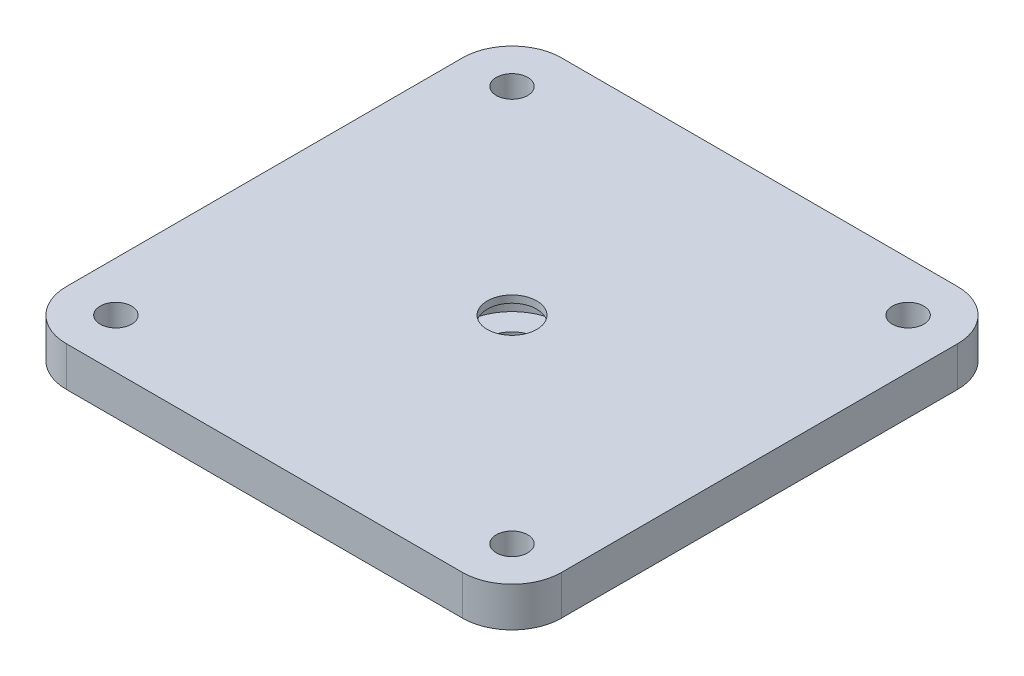
ISO-10303-21;
HEADER;
FILE_DESCRIPTION(('STEP AP214'),'2;1');
FILE_NAME('part.step','',(''),(''),'','','');
FILE_SCHEMA(('AUTOMOTIVE_DESIGN { 1 0 10303 214 1 1 1 1 }'));
ENDSEC;
DATA;
#1=APPLICATION_CONTEXT('core data for automotive mechanical design processes');
#2=APPLICATION_PROTOCOL_DEFINITION('international standard','automotive_design',2000,#1);
#3=PRODUCT_CONTEXT('',#1,'mechanical');
#4=PRODUCT('Part','Part','',(#3));
#5=PRODUCT_RELATED_PRODUCT_CATEGORY('part','',(#4));
#6=PRODUCT_DEFINITION_FORMATION('','',#4);
#7=PRODUCT_DEFINITION_CONTEXT('part definition',#1,'design');
#8=PRODUCT_DEFINITION('design','',#6,#7);
#9=PRODUCT_DEFINITION_SHAPE('','',#8);
#10=(LENGTH_UNIT() NAMED_UNIT(*) SI_UNIT(.MILLI.,.METRE.));
#11=(NAMED_UNIT(*) PLANE_ANGLE_UNIT() SI_UNIT($,.RADIAN.));
#12=(NAMED_UNIT(*) SI_UNIT($,.STERADIAN.) SOLID_ANGLE_UNIT());
#13=UNCERTAINTY_MEASURE_WITH_UNIT(LENGTH_MEASURE(1.E-05),#10,'distance_accuracy_value','');
#14=(GEOMETRIC_REPRESENTATION_CONTEXT(3) GLOBAL_UNCERTAINTY_ASSIGNED_CONTEXT((#13)) GLOBAL_UNIT_ASSIGNED_CONTEXT((#10,
#11,#12)) REPRESENTATION_CONTEXT('',''));
#15=CARTESIAN_POINT('',(0.,0.,0.));
#16=DIRECTION('',(0.,0.,1.));
#17=DIRECTION('',(1.,0.,0.));
#18=AXIS2_PLACEMENT_3D('',#15,#16,#17);
#19=CARTESIAN_POINT('',(-1.19904076738608,0.,-2.75779376498803));
#20=DIRECTION('',(0.,1.,0.));
#21=DIRECTION('',(0.,0.,1.));
#22=AXIS2_PLACEMENT_3D('',#19,#20,#21);
#23=CYLINDRICAL_SURFACE('',#22,5.);
#24=CARTESIAN_POINT('',(-1.19904076738608,3.55,-2.75779376498803));
#25=DIRECTION('',(0.,1.,0.));
#26=DIRECTION('',(0.,0.,1.));
#27=AXIS2_PLACEMENT_3D('',#24,#25,#26);
#28=CIRCLE('',#27,5.);
#29=CARTESIAN_POINT('',(-1.19904076738608,3.55,2.24220623501198));
#30=VERTEX_POINT('',#29);
#31=EDGE_CURVE('E62',#30,#30,#28,.F.);
#32=ORIENTED_EDGE('',*,*,#31,.F.);
#33=EDGE_LOOP('',(#32));
#34=FACE_BOUND('',#33,.T.);
#35=CARTESIAN_POINT('',(-1.19904076738608,2.,-2.75779376498803));
#36=DIRECTION('',(0.,-1.,0.));
#37=DIRECTION('',(0.,0.,-1.));
#38=AXIS2_PLACEMENT_3D('',#35,#36,#37);
#39=CIRCLE('',#38,5.);
#40=CARTESIAN_POINT('',(-1.19904076738608,2.,-7.75779376498803));
#41=VERTEX_POINT('',#40);
#42=EDGE_CURVE('E223',#41,#41,#39,.F.);
#43=ORIENTED_EDGE('',*,*,#42,.F.);
#44=EDGE_LOOP('',(#43));
#45=FACE_BOUND('',#44,.T.);
#46=ADVANCED_FACE('F58',(#34,#45),#23,.F.);
#47=CARTESIAN_POINT('',(48.8009592326139,10.,0.));
#48=DIRECTION('',(1.,0.,0.));
#49=DIRECTION('',(0.,0.,-1.));
#50=AXIS2_PLACEMENT_3D('',#47,#48,#49);
#51=PLANE('',#50);
#52=DIRECTION('',(0.,-1.,0.));
#53=VECTOR('',#52,1.);
#54=CARTESIAN_POINT('',(48.8009592326139,10.,37.2422062350119));
#55=LINE('',#54,#53);
#56=CARTESIAN_POINT('',(48.8009592326139,10.,37.2422062350119));
#57=VERTEX_POINT('',#56);
#58=CARTESIAN_POINT('',(48.8009592326139,2.,37.2422062350119));
#59=VERTEX_POINT('',#58);
#60=EDGE_CURVE('E142',#57,#59,#55,.T.);
#61=ORIENTED_EDGE('',*,*,#60,.T.);
#62=DIRECTION('',(0.,0.,1.));
#63=VECTOR('',#62,1.);
#64=CARTESIAN_POINT('',(48.8009592326139,2.,-42.757793764988));
#65=LINE('',#64,#63);
#66=CARTESIAN_POINT('',(48.8009592326139,2.,-42.757793764988));
#67=VERTEX_POINT('',#66);
#68=EDGE_CURVE('E76',#67,#59,#65,.T.);
#69=ORIENTED_EDGE('',*,*,#68,.F.);
#70=DIRECTION('',(0.,-1.,0.));
#71=VECTOR('',#70,1.);
#72=CARTESIAN_POINT('',(48.8009592326139,10.,-42.757793764988));
#73=LINE('',#72,#71);
#74=CARTESIAN_POINT('',(48.8009592326139,10.,-42.757793764988));
#75=VERTEX_POINT('',#74);
#76=EDGE_CURVE('E11',#75,#67,#73,.T.);
#77=ORIENTED_EDGE('',*,*,#76,.F.);
#78=DIRECTION('',(0.,0.,1.));
#79=VECTOR('',#78,1.);
#80=CARTESIAN_POINT('',(48.8009592326139,10.,0.));
#81=LINE('',#80,#79);
#82=EDGE_CURVE('E152',#75,#57,#81,.T.);
#83=ORIENTED_EDGE('',*,*,#82,.T.);
#84=EDGE_LOOP('',(#61,#69,#77,#83));
#85=FACE_BOUND('',#84,.T.);
#86=ADVANCED_FACE('F139',(#85),#51,.T.);
#87=CARTESIAN_POINT('',(38.8009592326139,10.,-42.757793764988));
#88=DIRECTION('',(0.,-1.,0.));
#89=DIRECTION('',(0.,0.,-1.));
#90=AXIS2_PLACEMENT_3D('',#87,#88,#89);
#91=CYLINDRICAL_SURFACE('',#90,10.);
#92=CARTESIAN_POINT('',(38.8009592326139,2.,-42.757793764988));
#93=DIRECTION('',(0.,-1.,0.));
#94=DIRECTION('',(0.,0.,-1.));
#95=AXIS2_PLACEMENT_3D('',#92,#93,#94);
#96=CIRCLE('',#95,10.);
#97=CARTESIAN_POINT('',(38.8009592326139,2.,-52.757793764988));
#98=VERTEX_POINT('',#97);
#99=EDGE_CURVE('E127',#98,#67,#96,.T.);
#100=ORIENTED_EDGE('',*,*,#99,.F.);
#101=DIRECTION('',(0.,-1.,0.));
#102=VECTOR('',#101,1.);
#103=CARTESIAN_POINT('',(38.8009592326139,10.,-52.757793764988));
#104=LINE('',#103,#102);
#105=CARTESIAN_POINT('',(38.8009592326139,10.,-52.757793764988));
#106=VERTEX_POINT('',#105);
#107=EDGE_CURVE('E68',#106,#98,#104,.T.);
#108=ORIENTED_EDGE('',*,*,#107,.F.);
#109=CARTESIAN_POINT('',(38.8009592326139,10.,-42.757793764988));
#110=DIRECTION('',(0.,1.,0.));
#111=DIRECTION('',(0.,0.,1.));
#112=AXIS2_PLACEMENT_3D('',#109,#110,#111);
#113=CIRCLE('',#112,10.);
#114=EDGE_CURVE('E147',#75,#106,#113,.T.);
#115=ORIENTED_EDGE('',*,*,#114,.F.);
#116=ORIENTED_EDGE('',*,*,#76,.T.);
#117=EDGE_LOOP('',(#100,#108,#115,#116));
#118=FACE_BOUND('',#117,.T.);
#119=ADVANCED_FACE('F146',(#118),#91,.T.);
#120=CARTESIAN_POINT('',(0.,10.,-52.757793764988));
#121=DIRECTION('',(0.,0.,-1.));
#122=DIRECTION('',(-1.,0.,0.));
#123=AXIS2_PLACEMENT_3D('',#120,#121,#122);
#124=PLANE('',#123);
#125=ORIENTED_EDGE('',*,*,#107,.T.);
#126=DIRECTION('',(1.,0.,0.));
#127=VECTOR('',#126,1.);
#128=CARTESIAN_POINT('',(-41.199040767386,2.,-52.757793764988));
#129=LINE('',#128,#127);
#130=CARTESIAN_POINT('',(-41.1990407673861,2.,-52.757793764988));
#131=VERTEX_POINT('',#130);
#132=EDGE_CURVE('E131',#131,#98,#129,.T.);
#133=ORIENTED_EDGE('',*,*,#132,.F.);
#134=DIRECTION('',(0.,-1.,0.));
#135=VECTOR('',#134,1.);
#136=CARTESIAN_POINT('',(-41.199040767386,10.,-52.757793764988));
#137=LINE('',#136,#135);
#138=CARTESIAN_POINT('',(-41.199040767386,10.,-52.757793764988));
#139=VERTEX_POINT('',#138);
#140=EDGE_CURVE('E201',#139,#131,#137,.T.);
#141=ORIENTED_EDGE('',*,*,#140,.F.);
#142=DIRECTION('',(1.,0.,0.));
#143=VECTOR('',#142,1.);
#144=CARTESIAN_POINT('',(0.,10.,-52.757793764988));
#145=LINE('',#144,#143);
#146=EDGE_CURVE('E151',#139,#106,#145,.T.);
#147=ORIENTED_EDGE('',*,*,#146,.T.);
#148=EDGE_LOOP('',(#125,#133,#141,#147));
#149=FACE_BOUND('',#148,.T.);
#150=ADVANCED_FACE('F311',(#149),#124,.T.);
#151=CARTESIAN_POINT('',(-41.1990407673861,10.,-42.757793764988));
#152=DIRECTION('',(0.,-1.,0.));
#153=DIRECTION('',(0.,0.,-1.));
#154=AXIS2_PLACEMENT_3D('',#151,#152,#153);
#155=CYLINDRICAL_SURFACE('',#154,10.);
#156=CARTESIAN_POINT('',(-41.1990407673861,2.,-42.757793764988));
#157=DIRECTION('',(0.,-1.,0.));
#158=DIRECTION('',(0.,0.,-1.));
#159=AXIS2_PLACEMENT_3D('',#156,#157,#158);
#160=CIRCLE('',#159,10.);
#161=CARTESIAN_POINT('',(-51.1990407673861,2.,-42.757793764988));
#162=VERTEX_POINT('',#161);
#163=EDGE_CURVE('E280',#162,#131,#160,.T.);
#164=ORIENTED_EDGE('',*,*,#163,.F.);
#165=DIRECTION('',(0.,-1.,0.));
#166=VECTOR('',#165,1.);
#167=CARTESIAN_POINT('',(-51.1990407673861,10.,-42.757793764988));
#168=LINE('',#167,#166);
#169=CARTESIAN_POINT('',(-51.1990407673861,10.,-42.757793764988));
#170=VERTEX_POINT('',#169);
#171=EDGE_CURVE('E197',#170,#162,#168,.T.);
#172=ORIENTED_EDGE('',*,*,#171,.F.);
#173=CARTESIAN_POINT('',(-41.1990407673861,10.,-42.757793764988));
#174=DIRECTION('',(0.,1.,0.));
#175=DIRECTION('',(0.,0.,1.));
#176=AXIS2_PLACEMENT_3D('',#173,#174,#175);
#177=CIRCLE('',#176,10.);
#178=EDGE_CURVE('E166',#139,#170,#177,.T.);
#179=ORIENTED_EDGE('',*,*,#178,.F.);
#180=ORIENTED_EDGE('',*,*,#140,.T.);
#181=EDGE_LOOP('',(#164,#172,#179,#180));
#182=FACE_BOUND('',#181,.T.);
#183=ADVANCED_FACE('F309',(#182),#155,.T.);
#184=CARTESIAN_POINT('',(-51.1990407673861,10.,0.));
#185=DIRECTION('',(1.,0.,0.));
#186=DIRECTION('',(0.,0.,-1.));
#187=AXIS2_PLACEMENT_3D('',#184,#185,#186);
#188=PLANE('',#187);
#189=DIRECTION('',(0.,0.,-1.));
#190=VECTOR('',#189,1.);
#191=CARTESIAN_POINT('',(-51.1990407673861,2.,37.2422062350119));
#192=LINE('',#191,#190);
#193=CARTESIAN_POINT('',(-51.1990407673861,2.,37.2422062350119));
#194=VERTEX_POINT('',#193);
#195=EDGE_CURVE('E283',#194,#162,#192,.T.);
#196=ORIENTED_EDGE('',*,*,#195,.F.);
#197=DIRECTION('',(0.,-1.,0.));
#198=VECTOR('',#197,1.);
#199=CARTESIAN_POINT('',(-51.1990407673861,10.,37.2422062350119));
#200=LINE('',#199,#198);
#201=CARTESIAN_POINT('',(-51.1990407673861,10.,37.2422062350119));
#202=VERTEX_POINT('',#201);
#203=EDGE_CURVE('E193',#202,#194,#200,.T.);
#204=ORIENTED_EDGE('',*,*,#203,.F.);
#205=DIRECTION('',(0.,0.,1.));
#206=VECTOR('',#205,1.);
#207=CARTESIAN_POINT('',(-51.1990407673861,10.,0.));
#208=LINE('',#207,#206);
#209=EDGE_CURVE('E170',#170,#202,#208,.T.);
#210=ORIENTED_EDGE('',*,*,#209,.F.);
#211=ORIENTED_EDGE('',*,*,#171,.T.);
#212=EDGE_LOOP('',(#196,#204,#210,#211));
#213=FACE_BOUND('',#212,.T.);
#214=ADVANCED_FACE('F305',(#213),#188,.F.);
#215=CARTESIAN_POINT('',(-41.1990407673861,10.,37.242206235012));
#216=DIRECTION('',(0.,-1.,0.));
#217=DIRECTION('',(0.,0.,-1.));
#218=AXIS2_PLACEMENT_3D('',#215,#216,#217);
#219=CYLINDRICAL_SURFACE('',#218,10.);
#220=CARTESIAN_POINT('',(-41.1990407673861,2.,37.242206235012));
#221=DIRECTION('',(0.,-1.,0.));
#222=DIRECTION('',(0.,0.,-1.));
#223=AXIS2_PLACEMENT_3D('',#220,#221,#222);
#224=CIRCLE('',#223,10.);
#225=CARTESIAN_POINT('',(-41.199040767386,2.,47.242206235012));
#226=VERTEX_POINT('',#225);
#227=EDGE_CURVE('E286',#226,#194,#224,.T.);
#228=ORIENTED_EDGE('',*,*,#227,.F.);
#229=DIRECTION('',(0.,-1.,0.));
#230=VECTOR('',#229,1.);
#231=CARTESIAN_POINT('',(-41.199040767386,10.,47.242206235012));
#232=LINE('',#231,#230);
#233=CARTESIAN_POINT('',(-41.199040767386,10.,47.242206235012));
#234=VERTEX_POINT('',#233);
#235=EDGE_CURVE('E189',#234,#226,#232,.T.);
#236=ORIENTED_EDGE('',*,*,#235,.F.);
#237=CARTESIAN_POINT('',(-41.1990407673861,10.,37.242206235012));
#238=DIRECTION('',(0.,1.,0.));
#239=DIRECTION('',(0.,0.,1.));
#240=AXIS2_PLACEMENT_3D('',#237,#238,#239);
#241=CIRCLE('',#240,10.);
#242=EDGE_CURVE('E174',#202,#234,#241,.T.);
#243=ORIENTED_EDGE('',*,*,#242,.F.);
#244=ORIENTED_EDGE('',*,*,#203,.T.);
#245=EDGE_LOOP('',(#228,#236,#243,#244));
#246=FACE_BOUND('',#245,.T.);
#247=ADVANCED_FACE('F301',(#246),#219,.T.);
#248=CARTESIAN_POINT('',(0.,10.,47.242206235012));
#249=DIRECTION('',(0.,0.,-1.));
#250=DIRECTION('',(-1.,0.,0.));
#251=AXIS2_PLACEMENT_3D('',#248,#249,#250);
#252=PLANE('',#251);
#253=DIRECTION('',(-1.,0.,0.));
#254=VECTOR('',#253,1.);
#255=CARTESIAN_POINT('',(38.8009592326139,2.,47.242206235012));
#256=LINE('',#255,#254);
#257=CARTESIAN_POINT('',(38.8009592326139,2.,47.242206235012));
#258=VERTEX_POINT('',#257);
#259=EDGE_CURVE('E289',#258,#226,#256,.T.);
#260=ORIENTED_EDGE('',*,*,#259,.F.);
#261=DIRECTION('',(0.,-1.,0.));
#262=VECTOR('',#261,1.);
#263=CARTESIAN_POINT('',(38.8009592326139,10.,47.242206235012));
#264=LINE('',#263,#262);
#265=CARTESIAN_POINT('',(38.8009592326139,10.,47.242206235012));
#266=VERTEX_POINT('',#265);
#267=EDGE_CURVE('E185',#266,#258,#264,.T.);
#268=ORIENTED_EDGE('',*,*,#267,.F.);
#269=DIRECTION('',(1.,0.,0.));
#270=VECTOR('',#269,1.);
#271=CARTESIAN_POINT('',(0.,10.,47.242206235012));
#272=LINE('',#271,#270);
#273=EDGE_CURVE('E178',#234,#266,#272,.T.);
#274=ORIENTED_EDGE('',*,*,#273,.F.);
#275=ORIENTED_EDGE('',*,*,#235,.T.);
#276=EDGE_LOOP('',(#260,#268,#274,#275));
#277=FACE_BOUND('',#276,.T.);
#278=ADVANCED_FACE('F256',(#277),#252,.F.);
#279=CARTESIAN_POINT('',(-41.1990407673861,10.,-42.757793764988));
#280=DIRECTION('',(0.,-1.,0.));
#281=DIRECTION('',(0.,0.,-1.));
#282=AXIS2_PLACEMENT_3D('',#279,#280,#281);
#283=CYLINDRICAL_SURFACE('',#282,3.175);
#284=CARTESIAN_POINT('',(-41.1990407673861,10.,-42.757793764988));
#285=DIRECTION('',(0.,1.,0.));
#286=DIRECTION('',(0.,0.,1.));
#287=AXIS2_PLACEMENT_3D('',#284,#285,#286);
#288=CIRCLE('',#287,3.175);
#289=CARTESIAN_POINT('',(-41.1990407673861,10.,-39.582793764988));
#290=VERTEX_POINT('',#289);
#291=EDGE_CURVE('E156',#290,#290,#288,.T.);
#292=ORIENTED_EDGE('',*,*,#291,.T.);
#293=EDGE_LOOP('',(#292));
#294=FACE_BOUND('',#293,.T.);
#295=CARTESIAN_POINT('',(-41.1990407673861,2.,-42.757793764988));
#296=DIRECTION('',(0.,-1.,0.));
#297=DIRECTION('',(0.,0.,-1.));
#298=AXIS2_PLACEMENT_3D('',#295,#296,#297);
#299=CIRCLE('',#298,3.175);
#300=CARTESIAN_POINT('',(-41.1990407673861,2.,-45.932793764988));
#301=VERTEX_POINT('',#300);
#302=EDGE_CURVE('E260',#301,#301,#299,.T.);
#303=ORIENTED_EDGE('',*,*,#302,.T.);
#304=EDGE_LOOP('',(#303));
#305=FACE_BOUND('',#304,.T.);
#306=ADVANCED_FACE('F253',(#294,#305),#283,.F.);
#307=CARTESIAN_POINT('',(38.8009592326139,10.,-42.757793764988));
#308=DIRECTION('',(0.,-1.,0.));
#309=DIRECTION('',(0.,0.,-1.));
#310=AXIS2_PLACEMENT_3D('',#307,#308,#309);
#311=CYLINDRICAL_SURFACE('',#310,3.175);
#312=CARTESIAN_POINT('',(38.8009592326139,10.,-42.757793764988));
#313=DIRECTION('',(0.,1.,0.));
#314=DIRECTION('',(0.,0.,1.));
#315=AXIS2_PLACEMENT_3D('',#312,#313,#314);
#316=CIRCLE('',#315,3.175);
#317=CARTESIAN_POINT('',(38.8009592326139,10.,-39.582793764988));
#318=VERTEX_POINT('',#317);
#319=EDGE_CURVE('E160',#318,#318,#316,.T.);
#320=ORIENTED_EDGE('',*,*,#319,.T.);
#321=EDGE_LOOP('',(#320));
#322=FACE_BOUND('',#321,.T.);
#323=CARTESIAN_POINT('',(38.8009592326139,2.,-42.757793764988));
#324=DIRECTION('',(0.,-1.,0.));
#325=DIRECTION('',(0.,0.,-1.));
#326=AXIS2_PLACEMENT_3D('',#323,#324,#325);
#327=CIRCLE('',#326,3.175);
#328=CARTESIAN_POINT('',(38.8009592326139,2.,-45.932793764988));
#329=VERTEX_POINT('',#328);
#330=EDGE_CURVE('E263',#329,#329,#327,.T.);
#331=ORIENTED_EDGE('',*,*,#330,.T.);
#332=EDGE_LOOP('',(#331));
#333=FACE_BOUND('',#332,.T.);
#334=ADVANCED_FACE('F242',(#322,#333),#311,.F.);
#335=CARTESIAN_POINT('',(38.8009592326139,10.,37.242206235012));
#336=DIRECTION('',(0.,-1.,0.));
#337=DIRECTION('',(0.,0.,-1.));
#338=AXIS2_PLACEMENT_3D('',#335,#336,#337);
#339=CYLINDRICAL_SURFACE('',#338,3.175);
#340=CARTESIAN_POINT('',(38.8009592326139,10.,37.242206235012));
#341=DIRECTION('',(0.,1.,0.));
#342=DIRECTION('',(0.,0.,1.));
#343=AXIS2_PLACEMENT_3D('',#340,#341,#342);
#344=CIRCLE('',#343,3.175);
#345=CARTESIAN_POINT('',(38.8009592326139,10.,40.417206235012));
#346=VERTEX_POINT('',#345);
#347=EDGE_CURVE('E235',#346,#346,#344,.T.);
#348=ORIENTED_EDGE('',*,*,#347,.T.);
#349=EDGE_LOOP('',(#348));
#350=FACE_BOUND('',#349,.T.);
#351=CARTESIAN_POINT('',(38.8009592326139,2.,37.242206235012));
#352=DIRECTION('',(0.,-1.,0.));
#353=DIRECTION('',(0.,0.,-1.));
#354=AXIS2_PLACEMENT_3D('',#351,#352,#353);
#355=CIRCLE('',#354,3.175);
#356=CARTESIAN_POINT('',(38.8009592326139,2.,34.067206235012));
#357=VERTEX_POINT('',#356);
#358=EDGE_CURVE('E268',#357,#357,#355,.T.);
#359=ORIENTED_EDGE('',*,*,#358,.T.);
#360=EDGE_LOOP('',(#359));
#361=FACE_BOUND('',#360,.T.);
#362=ADVANCED_FACE('F345',(#350,#361),#339,.F.);
#363=CARTESIAN_POINT('',(-41.1990407673861,10.,37.242206235012));
#364=DIRECTION('',(0.,-1.,0.));
#365=DIRECTION('',(0.,0.,-1.));
#366=AXIS2_PLACEMENT_3D('',#363,#364,#365);
#367=CYLINDRICAL_SURFACE('',#366,3.175);
#368=CARTESIAN_POINT('',(-41.1990407673861,10.,37.242206235012));
#369=DIRECTION('',(0.,1.,0.));
#370=DIRECTION('',(0.,0.,1.));
#371=AXIS2_PLACEMENT_3D('',#368,#369,#370);
#372=CIRCLE('',#371,3.175);
#373=CARTESIAN_POINT('',(-41.1990407673861,10.,40.417206235012));
#374=VERTEX_POINT('',#373);
#375=EDGE_CURVE('E231',#374,#374,#372,.T.);
#376=ORIENTED_EDGE('',*,*,#375,.T.);
#377=EDGE_LOOP('',(#376));
#378=FACE_BOUND('',#377,.T.);
#379=CARTESIAN_POINT('',(-41.1990407673861,2.,37.242206235012));
#380=DIRECTION('',(0.,-1.,0.));
#381=DIRECTION('',(0.,0.,-1.));
#382=AXIS2_PLACEMENT_3D('',#379,#380,#381);
#383=CIRCLE('',#382,3.175);
#384=CARTESIAN_POINT('',(-41.1990407673861,2.,34.067206235012));
#385=VERTEX_POINT('',#384);
#386=EDGE_CURVE('E274',#385,#385,#383,.T.);
#387=ORIENTED_EDGE('',*,*,#386,.T.);
#388=EDGE_LOOP('',(#387));
#389=FACE_BOUND('',#388,.T.);
#390=ADVANCED_FACE('F60',(#378,#389),#367,.F.);
#391=CARTESIAN_POINT('',(38.8009592326139,10.,37.242206235012));
#392=DIRECTION('',(0.,-1.,0.));
#393=DIRECTION('',(0.,0.,-1.));
#394=AXIS2_PLACEMENT_3D('',#391,#392,#393);
#395=CYLINDRICAL_SURFACE('',#394,9.99999999999999);
#396=CARTESIAN_POINT('',(38.8009592326139,2.,37.242206235012));
#397=DIRECTION('',(0.,-1.,0.));
#398=DIRECTION('',(0.,0.,-1.));
#399=AXIS2_PLACEMENT_3D('',#396,#397,#398);
#400=CIRCLE('',#399,9.99999999999999);
#401=EDGE_CURVE('E144',#59,#258,#400,.T.);
#402=ORIENTED_EDGE('',*,*,#401,.F.);
#403=ORIENTED_EDGE('',*,*,#60,.F.);
#404=CARTESIAN_POINT('',(38.8009592326139,10.,37.242206235012));
#405=DIRECTION('',(0.,1.,0.));
#406=DIRECTION('',(0.,0.,1.));
#407=AXIS2_PLACEMENT_3D('',#404,#405,#406);
#408=CIRCLE('',#407,9.99999999999999);
#409=EDGE_CURVE('E86',#266,#57,#408,.T.);
#410=ORIENTED_EDGE('',*,*,#409,.F.);
#411=ORIENTED_EDGE('',*,*,#267,.T.);
#412=EDGE_LOOP('',(#402,#403,#410,#411));
#413=FACE_BOUND('',#412,.T.);
#414=ADVANCED_FACE('F248',(#413),#395,.T.);
#415=CARTESIAN_POINT('',(0.,10.,0.));
#416=DIRECTION('',(0.,1.,0.));
#417=DIRECTION('',(0.,0.,1.));
#418=AXIS2_PLACEMENT_3D('',#415,#416,#417);
#419=PLANE('',#418);
#420=CARTESIAN_POINT('',(-1.19904076738608,10.,-2.75779376498803));
#421=DIRECTION('',(0.,1.,0.));
#422=DIRECTION('',(0.,0.,1.));
#423=AXIS2_PLACEMENT_3D('',#420,#421,#422);
#424=CIRCLE('',#423,5.);
#425=CARTESIAN_POINT('',(-1.19904076738608,10.,2.24220623501198));
#426=VERTEX_POINT('',#425);
#427=EDGE_CURVE('E215',#426,#426,#424,.T.);
#428=ORIENTED_EDGE('',*,*,#427,.F.);
#429=EDGE_LOOP('',(#428));
#430=FACE_BOUND('',#429,.T.);
#431=ORIENTED_EDGE('',*,*,#375,.F.);
#432=EDGE_LOOP('',(#431));
#433=FACE_BOUND('',#432,.T.);
#434=ORIENTED_EDGE('',*,*,#347,.F.);
#435=EDGE_LOOP('',(#434));
#436=FACE_BOUND('',#435,.T.);
#437=ORIENTED_EDGE('',*,*,#319,.F.);
#438=EDGE_LOOP('',(#437));
#439=FACE_BOUND('',#438,.T.);
#440=ORIENTED_EDGE('',*,*,#291,.F.);
#441=EDGE_LOOP('',(#440));
#442=FACE_BOUND('',#441,.T.);
#443=ORIENTED_EDGE('',*,*,#82,.F.);
#444=ORIENTED_EDGE('',*,*,#114,.T.);
#445=ORIENTED_EDGE('',*,*,#146,.F.);
#446=ORIENTED_EDGE('',*,*,#178,.T.);
#447=ORIENTED_EDGE('',*,*,#209,.T.);
#448=ORIENTED_EDGE('',*,*,#242,.T.);
#449=ORIENTED_EDGE('',*,*,#273,.T.);
#450=ORIENTED_EDGE('',*,*,#409,.T.);
#451=EDGE_LOOP('',(#443,#444,#445,#446,#447,#448,#449,#450));
#452=FACE_BOUND('',#451,.T.);
#453=ADVANCED_FACE('F154',(#430,#433,#436,#439,#442,#452),#419,.T.);
#454=CARTESIAN_POINT('',(-1.19904076738608,8.55,-2.75779376498803));
#455=DIRECTION('',(0.,1.,0.));
#456=DIRECTION('',(0.,0.,1.));
#457=AXIS2_PLACEMENT_3D('',#454,#455,#456);
#458=CIRCLE('',#457,5.);
#459=CARTESIAN_POINT('',(-1.19904076738608,8.55,2.24220623501198));
#460=VERTEX_POINT('',#459);
#461=EDGE_CURVE('E206',#460,#460,#458,.F.);
#462=ORIENTED_EDGE('',*,*,#461,.T.);
#463=EDGE_LOOP('',(#462));
#464=FACE_BOUND('',#463,.T.);
#465=ORIENTED_EDGE('',*,*,#427,.T.);
#466=EDGE_LOOP('',(#465));
#467=FACE_BOUND('',#466,.T.);
#468=ADVANCED_FACE('F247',(#464,#467),#23,.F.);
#469=CARTESIAN_POINT('',(-1.19904076738608,3.55,-2.75779376498803));
#470=DIRECTION('',(0.,1.,0.));
#471=DIRECTION('',(0.,0.,1.));
#472=AXIS2_PLACEMENT_3D('',#469,#470,#471);
#473=PLANE('',#472);
#474=CARTESIAN_POINT('',(-1.19904076738608,3.55,-2.75779376498803));
#475=DIRECTION('',(0.,1.,0.));
#476=DIRECTION('',(0.,0.,1.));
#477=AXIS2_PLACEMENT_3D('',#474,#475,#476);
#478=CIRCLE('',#477,10.);
#479=CARTESIAN_POINT('',(-1.19904076738608,3.55,7.24220623501197));
#480=VERTEX_POINT('',#479);
#481=EDGE_CURVE('E209',#480,#480,#478,.T.);
#482=ORIENTED_EDGE('',*,*,#481,.T.);
#483=EDGE_LOOP('',(#482));
#484=FACE_BOUND('',#483,.T.);
#485=ORIENTED_EDGE('',*,*,#31,.T.);
#486=EDGE_LOOP('',(#485));
#487=FACE_BOUND('',#486,.T.);
#488=ADVANCED_FACE('F331',(#484,#487),#473,.T.);
#489=CARTESIAN_POINT('',(-1.19904076738608,8.55,-2.75779376498803));
#490=DIRECTION('',(0.,1.,0.));
#491=DIRECTION('',(0.,0.,1.));
#492=AXIS2_PLACEMENT_3D('',#489,#490,#491);
#493=PLANE('',#492);
#494=CARTESIAN_POINT('',(-1.19904076738608,8.55,-2.75779376498803));
#495=DIRECTION('',(0.,1.,0.));
#496=DIRECTION('',(0.,0.,1.));
#497=AXIS2_PLACEMENT_3D('',#494,#495,#496);
#498=CIRCLE('',#497,10.);
#499=CARTESIAN_POINT('',(-1.19904076738608,8.55,7.24220623501197));
#500=VERTEX_POINT('',#499);
#501=EDGE_CURVE('E217',#500,#500,#498,.T.);
#502=ORIENTED_EDGE('',*,*,#501,.F.);
#503=EDGE_LOOP('',(#502));
#504=FACE_BOUND('',#503,.T.);
#505=ORIENTED_EDGE('',*,*,#461,.F.);
#506=EDGE_LOOP('',(#505));
#507=FACE_BOUND('',#506,.T.);
#508=ADVANCED_FACE('F336',(#504,#507),#493,.F.);
#509=CARTESIAN_POINT('',(-1.19904076738608,3.55,-2.75779376498803));
#510=DIRECTION('',(0.,1.,0.));
#511=DIRECTION('',(0.,0.,1.));
#512=AXIS2_PLACEMENT_3D('',#509,#510,#511);
#513=CYLINDRICAL_SURFACE('',#512,10.);
#514=ORIENTED_EDGE('',*,*,#481,.F.);
#515=EDGE_LOOP('',(#514));
#516=FACE_BOUND('',#515,.T.);
#517=ORIENTED_EDGE('',*,*,#501,.T.);
#518=EDGE_LOOP('',(#517));
#519=FACE_BOUND('',#518,.T.);
#520=ADVANCED_FACE('F352',(#516,#519),#513,.F.);
#521=CARTESIAN_POINT('',(38.8009592326139,2.,-42.757793764988));
#522=DIRECTION('',(0.,-1.,0.));
#523=DIRECTION('',(0.,0.,-1.));
#524=AXIS2_PLACEMENT_3D('',#521,#522,#523);
#525=PLANE('',#524);
#526=ORIENTED_EDGE('',*,*,#302,.F.);
#527=EDGE_LOOP('',(#526));
#528=FACE_BOUND('',#527,.T.);
#529=ORIENTED_EDGE('',*,*,#330,.F.);
#530=EDGE_LOOP('',(#529));
#531=FACE_BOUND('',#530,.T.);
#532=ORIENTED_EDGE('',*,*,#358,.F.);
#533=EDGE_LOOP('',(#532));
#534=FACE_BOUND('',#533,.T.);
#535=ORIENTED_EDGE('',*,*,#386,.F.);
#536=EDGE_LOOP('',(#535));
#537=FACE_BOUND('',#536,.T.);
#538=ORIENTED_EDGE('',*,*,#99,.T.);
#539=ORIENTED_EDGE('',*,*,#68,.T.);
#540=ORIENTED_EDGE('',*,*,#401,.T.);
#541=ORIENTED_EDGE('',*,*,#259,.T.);
#542=ORIENTED_EDGE('',*,*,#227,.T.);
#543=ORIENTED_EDGE('',*,*,#195,.T.);
#544=ORIENTED_EDGE('',*,*,#163,.T.);
#545=ORIENTED_EDGE('',*,*,#132,.T.);
#546=EDGE_LOOP('',(#538,#539,#540,#541,#542,#543,#544,#545));
#547=FACE_BOUND('',#546,.T.);
#548=ORIENTED_EDGE('',*,*,#42,.T.);
#549=EDGE_LOOP('',(#548));
#550=FACE_BOUND('',#549,.T.);
#551=ADVANCED_FACE('F128',(#528,#531,#534,#537,#547,#550),#525,.T.);
#552=CLOSED_SHELL('',(#46,#86,#119,#150,#183,#214,#247,#278,#306,#334,#362,#390,#414,#453,#468,
#488,#508,#520,#551));
#553=MANIFOLD_SOLID_BREP('B2',#552);
#554=ADVANCED_BREP_SHAPE_REPRESENTATION('',(#18,#553),#14);
#555=SHAPE_DEFINITION_REPRESENTATION(#9,#554);
ENDSEC;
END-ISO-10303-21;
